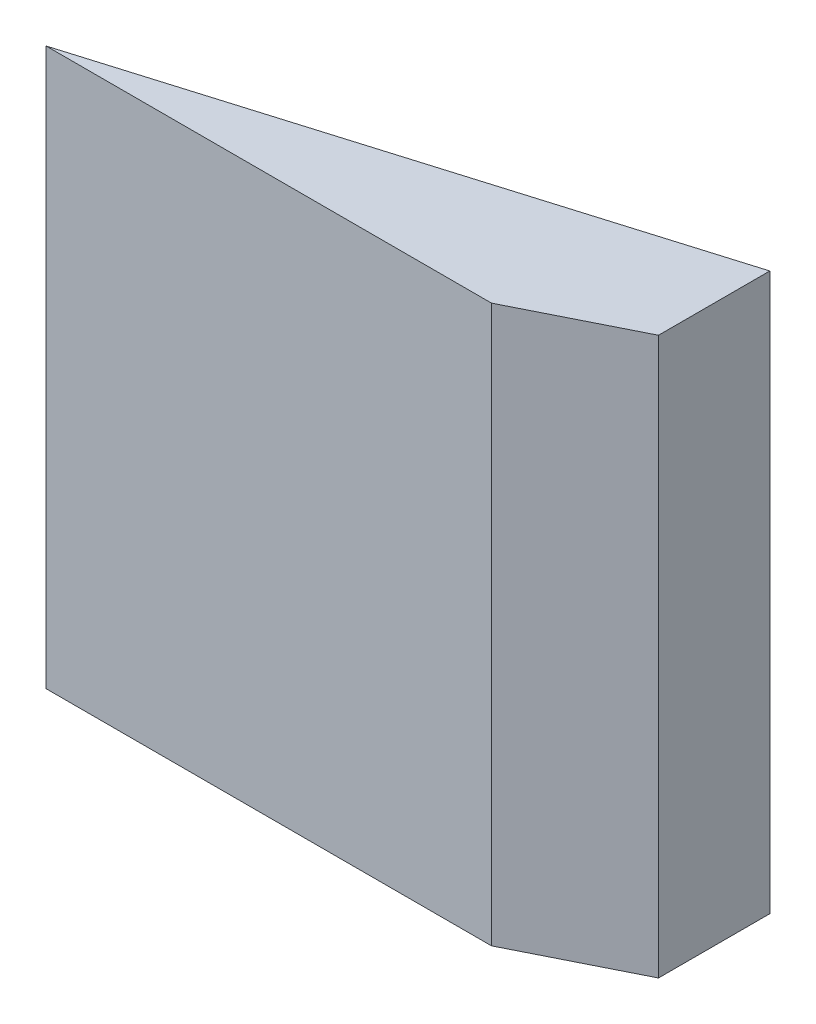
ISO-10303-21;
HEADER;
FILE_DESCRIPTION(('STEP AP214'),'2;1');
FILE_NAME('part.step','',(''),(''),'','','');
FILE_SCHEMA(('AUTOMOTIVE_DESIGN { 1 0 10303 214 1 1 1 1 }'));
ENDSEC;
DATA;
#1=APPLICATION_CONTEXT('core data for automotive mechanical design processes');
#2=APPLICATION_PROTOCOL_DEFINITION('international standard','automotive_design',2000,#1);
#3=PRODUCT_CONTEXT('',#1,'mechanical');
#4=PRODUCT('Part','Part','',(#3));
#5=PRODUCT_RELATED_PRODUCT_CATEGORY('part','',(#4));
#6=PRODUCT_DEFINITION_FORMATION('','',#4);
#7=PRODUCT_DEFINITION_CONTEXT('part definition',#1,'design');
#8=PRODUCT_DEFINITION('design','',#6,#7);
#9=PRODUCT_DEFINITION_SHAPE('','',#8);
#10=(LENGTH_UNIT() NAMED_UNIT(*) SI_UNIT(.MILLI.,.METRE.));
#11=(NAMED_UNIT(*) PLANE_ANGLE_UNIT() SI_UNIT($,.RADIAN.));
#12=(NAMED_UNIT(*) SI_UNIT($,.STERADIAN.) SOLID_ANGLE_UNIT());
#13=UNCERTAINTY_MEASURE_WITH_UNIT(LENGTH_MEASURE(1.E-05),#10,'distance_accuracy_value','');
#14=(GEOMETRIC_REPRESENTATION_CONTEXT(3) GLOBAL_UNCERTAINTY_ASSIGNED_CONTEXT((#13)) GLOBAL_UNIT_ASSIGNED_CONTEXT((#10,
#11,#12)) REPRESENTATION_CONTEXT('',''));
#15=CARTESIAN_POINT('',(0.,0.,0.));
#16=DIRECTION('',(0.,0.,1.));
#17=DIRECTION('',(1.,0.,0.));
#18=AXIS2_PLACEMENT_3D('',#15,#16,#17);
#19=CARTESIAN_POINT('',(0.,25.,0.));
#20=DIRECTION('',(0.,0.,-1.));
#21=DIRECTION('',(-1.,0.,0.));
#22=AXIS2_PLACEMENT_3D('',#19,#20,#21);
#23=PLANE('',#22);
#24=DIRECTION('',(1.,0.,0.));
#25=VECTOR('',#24,1.);
#26=CARTESIAN_POINT('',(0.,0.,0.));
#27=LINE('',#26,#25);
#28=CARTESIAN_POINT('',(0.,0.,0.));
#29=VERTEX_POINT('',#28);
#30=CARTESIAN_POINT('',(20.,0.,0.));
#31=VERTEX_POINT('',#30);
#32=EDGE_CURVE('E97',#29,#31,#27,.T.);
#33=ORIENTED_EDGE('',*,*,#32,.T.);
#34=DIRECTION('',(0.,-1.,0.));
#35=VECTOR('',#34,1.);
#36=CARTESIAN_POINT('',(20.,25.,0.));
#37=LINE('',#36,#35);
#38=CARTESIAN_POINT('',(20.,25.,0.));
#39=VERTEX_POINT('',#38);
#40=EDGE_CURVE('E11',#39,#31,#37,.T.);
#41=ORIENTED_EDGE('',*,*,#40,.F.);
#42=DIRECTION('',(1.,0.,0.));
#43=VECTOR('',#42,1.);
#44=CARTESIAN_POINT('',(0.,25.,0.));
#45=LINE('',#44,#43);
#46=CARTESIAN_POINT('',(0.,25.,0.));
#47=VERTEX_POINT('',#46);
#48=EDGE_CURVE('E85',#47,#39,#45,.T.);
#49=ORIENTED_EDGE('',*,*,#48,.F.);
#50=DIRECTION('',(0.,-1.,0.));
#51=VECTOR('',#50,1.);
#52=CARTESIAN_POINT('',(0.,25.,0.));
#53=LINE('',#52,#51);
#54=EDGE_CURVE('E93',#47,#29,#53,.T.);
#55=ORIENTED_EDGE('',*,*,#54,.T.);
#56=EDGE_LOOP('',(#33,#41,#49,#55));
#57=FACE_BOUND('',#56,.T.);
#58=ADVANCED_FACE('F34',(#57),#23,.F.);
#59=CARTESIAN_POINT('',(20.,25.,0.));
#60=DIRECTION('',(-0.447213595500013,0.,-0.894427190999888));
#61=DIRECTION('',(-0.894427190999888,0.,0.447213595500013));
#62=AXIS2_PLACEMENT_3D('',#59,#60,#61);
#63=PLANE('',#62);
#64=DIRECTION('',(0.894427190999888,0.,-0.447213595500013));
#65=VECTOR('',#64,1.);
#66=CARTESIAN_POINT('',(20.,0.,0.));
#67=LINE('',#66,#65);
#68=CARTESIAN_POINT('',(24.9999999999998,0.,-2.50000000000029));
#69=VERTEX_POINT('',#68);
#70=EDGE_CURVE('E89',#31,#69,#67,.T.);
#71=ORIENTED_EDGE('',*,*,#70,.T.);
#72=DIRECTION('',(0.,-1.,0.));
#73=VECTOR('',#72,1.);
#74=CARTESIAN_POINT('',(24.9999999999998,25.,-2.50000000000029));
#75=LINE('',#74,#73);
#76=CARTESIAN_POINT('',(24.9999999999998,25.,-2.50000000000029));
#77=VERTEX_POINT('',#76);
#78=EDGE_CURVE('E42',#77,#69,#75,.T.);
#79=ORIENTED_EDGE('',*,*,#78,.F.);
#80=DIRECTION('',(0.894427190999888,0.,-0.447213595500013));
#81=VECTOR('',#80,1.);
#82=CARTESIAN_POINT('',(20.,25.,0.));
#83=LINE('',#82,#81);
#84=EDGE_CURVE('E80',#39,#77,#83,.T.);
#85=ORIENTED_EDGE('',*,*,#84,.F.);
#86=ORIENTED_EDGE('',*,*,#40,.T.);
#87=EDGE_LOOP('',(#71,#79,#85,#86));
#88=FACE_BOUND('',#87,.T.);
#89=ADVANCED_FACE('F88',(#88),#63,.F.);
#90=CARTESIAN_POINT('',(25.,25.,-7.50000000000029));
#91=DIRECTION('',(-1.,0.,0.));
#92=DIRECTION('',(0.,0.,1.));
#93=AXIS2_PLACEMENT_3D('',#90,#91,#92);
#94=PLANE('',#93);
#95=DIRECTION('',(0.,0.,-1.));
#96=VECTOR('',#95,1.);
#97=CARTESIAN_POINT('',(25.,0.,-7.50000000000029));
#98=LINE('',#97,#96);
#99=CARTESIAN_POINT('',(25.,0.,-7.50000000000029));
#100=VERTEX_POINT('',#99);
#101=EDGE_CURVE('E67',#69,#100,#98,.T.);
#102=ORIENTED_EDGE('',*,*,#101,.T.);
#103=DIRECTION('',(0.,-1.,0.));
#104=VECTOR('',#103,1.);
#105=CARTESIAN_POINT('',(25.,25.,-7.50000000000029));
#106=LINE('',#105,#104);
#107=CARTESIAN_POINT('',(25.,25.,-7.50000000000029));
#108=VERTEX_POINT('',#107);
#109=EDGE_CURVE('E90',#108,#100,#106,.T.);
#110=ORIENTED_EDGE('',*,*,#109,.F.);
#111=DIRECTION('',(0.,0.,-1.));
#112=VECTOR('',#111,1.);
#113=CARTESIAN_POINT('',(25.,25.,-7.50000000000029));
#114=LINE('',#113,#112);
#115=EDGE_CURVE('E83',#77,#108,#114,.T.);
#116=ORIENTED_EDGE('',*,*,#115,.F.);
#117=ORIENTED_EDGE('',*,*,#78,.T.);
#118=EDGE_LOOP('',(#102,#110,#116,#117));
#119=FACE_BOUND('',#118,.T.);
#120=ADVANCED_FACE('F91',(#119),#94,.F.);
#121=CARTESIAN_POINT('',(0.,25.,0.));
#122=DIRECTION('',(0.287347885566356,0.,0.957826285221148));
#123=DIRECTION('',(0.957826285221148,0.,-0.287347885566356));
#124=AXIS2_PLACEMENT_3D('',#121,#122,#123);
#125=PLANE('',#124);
#126=DIRECTION('',(-0.957826285221148,0.,0.287347885566356));
#127=VECTOR('',#126,1.);
#128=CARTESIAN_POINT('',(0.,0.,0.));
#129=LINE('',#128,#127);
#130=EDGE_CURVE('E73',#100,#29,#129,.T.);
#131=ORIENTED_EDGE('',*,*,#130,.T.);
#132=ORIENTED_EDGE('',*,*,#54,.F.);
#133=DIRECTION('',(-0.957826285221148,0.,0.287347885566356));
#134=VECTOR('',#133,1.);
#135=CARTESIAN_POINT('',(0.,25.,0.));
#136=LINE('',#135,#134);
#137=EDGE_CURVE('E50',#108,#47,#136,.T.);
#138=ORIENTED_EDGE('',*,*,#137,.F.);
#139=ORIENTED_EDGE('',*,*,#109,.T.);
#140=EDGE_LOOP('',(#131,#132,#138,#139));
#141=FACE_BOUND('',#140,.T.);
#142=ADVANCED_FACE('F104',(#141),#125,.F.);
#143=CARTESIAN_POINT('',(0.,25.,0.));
#144=DIRECTION('',(0.,-1.,0.));
#145=DIRECTION('',(0.,0.,-1.));
#146=AXIS2_PLACEMENT_3D('',#143,#144,#145);
#147=PLANE('',#146);
#148=ORIENTED_EDGE('',*,*,#48,.T.);
#149=ORIENTED_EDGE('',*,*,#84,.T.);
#150=ORIENTED_EDGE('',*,*,#115,.T.);
#151=ORIENTED_EDGE('',*,*,#137,.T.);
#152=EDGE_LOOP('',(#148,#149,#150,#151));
#153=FACE_BOUND('',#152,.T.);
#154=ADVANCED_FACE('F81',(#153),#147,.F.);
#155=CARTESIAN_POINT('',(0.,0.,0.));
#156=DIRECTION('',(0.,-1.,0.));
#157=DIRECTION('',(0.,0.,-1.));
#158=AXIS2_PLACEMENT_3D('',#155,#156,#157);
#159=PLANE('',#158);
#160=ORIENTED_EDGE('',*,*,#32,.F.);
#161=ORIENTED_EDGE('',*,*,#130,.F.);
#162=ORIENTED_EDGE('',*,*,#101,.F.);
#163=ORIENTED_EDGE('',*,*,#70,.F.);
#164=EDGE_LOOP('',(#160,#161,#162,#163));
#165=FACE_BOUND('',#164,.T.);
#166=ADVANCED_FACE('F107',(#165),#159,.T.);
#167=CLOSED_SHELL('',(#58,#89,#120,#142,#154,#166));
#168=MANIFOLD_SOLID_BREP('B2',#167);
#169=ADVANCED_BREP_SHAPE_REPRESENTATION('',(#18,#168),#14);
#170=SHAPE_DEFINITION_REPRESENTATION(#9,#169);
ENDSEC;
END-ISO-10303-21;
